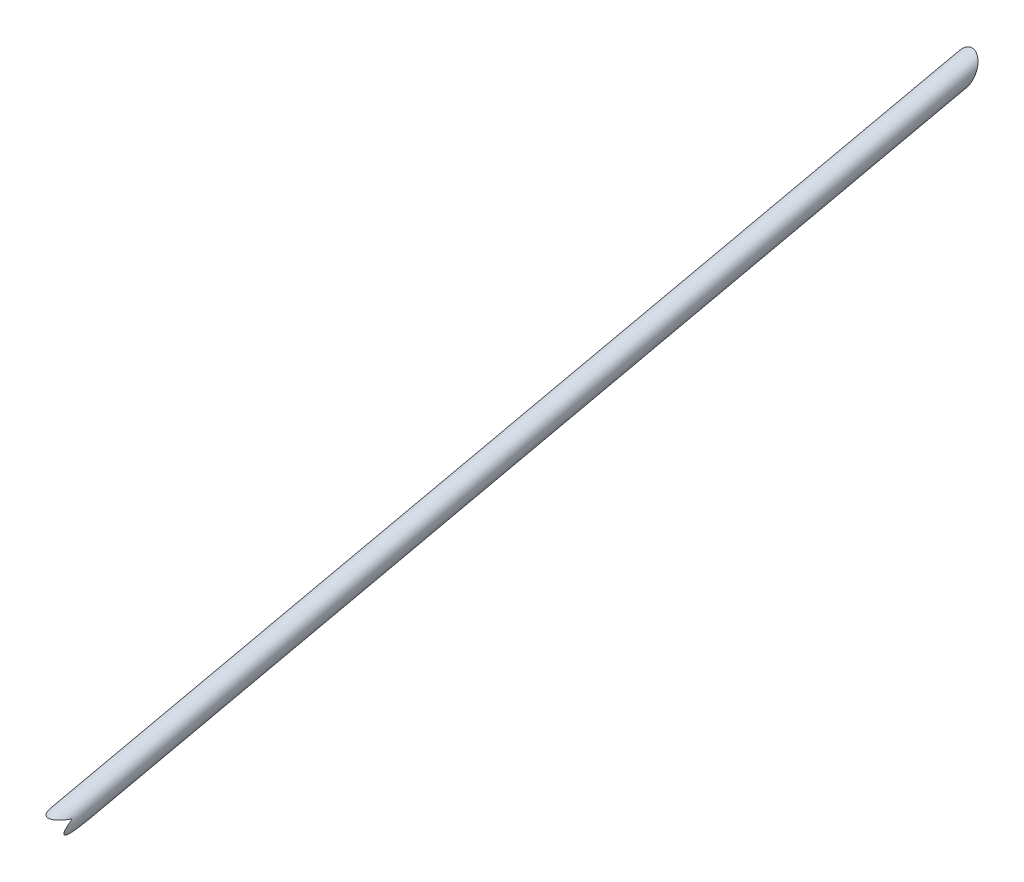
ISO-10303-21;
HEADER;
FILE_DESCRIPTION(('STEP AP214'),'2;1');
FILE_NAME('part.step','',(''),(''),'','','');
FILE_SCHEMA(('AUTOMOTIVE_DESIGN { 1 0 10303 214 1 1 1 1 }'));
ENDSEC;
DATA;
#1=APPLICATION_CONTEXT('core data for automotive mechanical design processes');
#2=APPLICATION_PROTOCOL_DEFINITION('international standard','automotive_design',2000,#1);
#3=PRODUCT_CONTEXT('',#1,'mechanical');
#4=PRODUCT('Part','Part','',(#3));
#5=PRODUCT_RELATED_PRODUCT_CATEGORY('part','',(#4));
#6=PRODUCT_DEFINITION_FORMATION('','',#4);
#7=PRODUCT_DEFINITION_CONTEXT('part definition',#1,'design');
#8=PRODUCT_DEFINITION('design','',#6,#7);
#9=PRODUCT_DEFINITION_SHAPE('','',#8);
#10=(LENGTH_UNIT() NAMED_UNIT(*) SI_UNIT(.MILLI.,.METRE.));
#11=(NAMED_UNIT(*) PLANE_ANGLE_UNIT() SI_UNIT($,.RADIAN.));
#12=(NAMED_UNIT(*) SI_UNIT($,.STERADIAN.) SOLID_ANGLE_UNIT());
#13=UNCERTAINTY_MEASURE_WITH_UNIT(LENGTH_MEASURE(1.E-05),#10,'distance_accuracy_value','');
#14=(GEOMETRIC_REPRESENTATION_CONTEXT(3) GLOBAL_UNCERTAINTY_ASSIGNED_CONTEXT((#13)) GLOBAL_UNIT_ASSIGNED_CONTEXT((#10,
#11,#12)) REPRESENTATION_CONTEXT('',''));
#15=CARTESIAN_POINT('',(0.,0.,0.));
#16=DIRECTION('',(0.,0.,1.));
#17=DIRECTION('',(1.,0.,0.));
#18=AXIS2_PLACEMENT_3D('',#15,#16,#17);
#19=CARTESIAN_POINT('',(-259.935326726564,10.,-1698.86453408839));
#20=DIRECTION('',(0.,-1.,0.));
#21=DIRECTION('',(0.,0.,-1.));
#22=AXIS2_PLACEMENT_3D('',#19,#20,#21);
#23=PLANE('',#22);
#24=CARTESIAN_POINT('',(174.290178571428,10.,-1013.28125));
#25=DIRECTION('',(0.,-1.,0.));
#26=DIRECTION('',(0.257001600590801,0.,-0.966410977428219));
#27=AXIS2_PLACEMENT_3D('',#24,#25,#26);
#28=ELLIPSE('',#27,20.327321302388,9.49999999999999);
#29=CARTESIAN_POINT('',(180.375016784295,10.,-1002.71182209354));
#30=VERTEX_POINT('',#29);
#31=CARTESIAN_POINT('',(183.391219448177,10.,-1029.10359540251));
#32=VERTEX_POINT('',#31);
#33=EDGE_CURVE('E11',#30,#32,#28,.T.);
#34=ORIENTED_EDGE('',*,*,#33,.T.);
#35=DIRECTION('',(-0.113546591160732,0.,0.993532672656404));
#36=VECTOR('',#35,1.);
#37=CARTESIAN_POINT('',(259.935326726564,10.,-1698.86453408839));
#38=LINE('',#37,#36);
#39=CARTESIAN_POINT('',(182.747352986209,10.,-1023.46976386029));
#40=VERTEX_POINT('',#39);
#41=EDGE_CURVE('E66',#32,#40,#38,.T.);
#42=ORIENTED_EDGE('',*,*,#41,.T.);
#43=CARTESIAN_POINT('',(174.290178571428,10.,-1013.28125));
#44=DIRECTION('',(0.,-1.,0.));
#45=DIRECTION('',(0.257001600590801,0.,-0.966410977428219));
#46=AXIS2_PLACEMENT_3D('',#43,#44,#45);
#47=ELLIPSE('',#46,16.9037724514595,7.90000000000002);
#48=CARTESIAN_POINT('',(181.018883246263,10.,-1008.34565363576));
#49=VERTEX_POINT('',#48);
#50=EDGE_CURVE('E81',#49,#40,#47,.T.);
#51=ORIENTED_EDGE('',*,*,#50,.F.);
#52=EDGE_CURVE('E68',#49,#30,#38,.T.);
#53=ORIENTED_EDGE('',*,*,#52,.T.);
#54=EDGE_LOOP('',(#34,#42,#51,#53));
#55=FACE_BOUND('',#54,.T.);
#56=ADVANCED_FACE('F41',(#55),#23,.T.);
#57=CARTESIAN_POINT('',(169.428571428571,1.66533453693773E-13,-994.999999999999));
#58=DIRECTION('',(0.227207840964846,0.4673512982197,-0.85437659205789));
#59=DIRECTION('',(0.,0.877321812102288,0.479902529696977));
#60=AXIS2_PLACEMENT_3D('',#57,#58,#59);
#61=CYLINDRICAL_SURFACE('',#60,9.49999999999999);
#62=ORIENTED_EDGE('',*,*,#33,.F.);
#63=CARTESIAN_POINT('',(187.078954115203,36.3056540110709,-1061.37127373899));
#64=DIRECTION('',(-0.993532672656404,0.,-0.113546591160732));
#65=DIRECTION('',(0.100146707762878,0.471272242379786,-0.876283692925177));
#66=AXIS2_PLACEMENT_3D('',#63,#64,#65);
#67=ELLIPSE('',#66,73.7996694176366,9.49999999999999);
#68=EDGE_CURVE('E73',#32,#30,#67,.T.);
#69=ORIENTED_EDGE('',*,*,#68,.F.);
#70=EDGE_LOOP('',(#62,#69));
#71=FACE_BOUND('',#70,.T.);
#72=CARTESIAN_POINT('',(325.,320.,-1580.));
#73=DIRECTION('',(0.0100583123703582,-0.349879267870479,-0.936740801004567));
#74=DIRECTION('',(0.287052887423583,0.898369431045867,-0.332465043552115));
#75=AXIS2_PLACEMENT_3D('',#72,#73,#74);
#76=ELLIPSE('',#75,14.8646950385778,9.49999999999999);
#77=CARTESIAN_POINT('',(329.266953631495,333.353987624478,-1584.94199148339));
#78=VERTEX_POINT('',#77);
#79=EDGE_CURVE('E50',#78,#78,#76,.T.);
#80=ORIENTED_EDGE('',*,*,#79,.F.);
#81=EDGE_LOOP('',(#80));
#82=FACE_BOUND('',#81,.T.);
#83=ADVANCED_FACE('F43',(#71,#82),#61,.T.);
#84=CARTESIAN_POINT('',(169.428571428571,1.66533453693773E-13,-994.999999999999));
#85=DIRECTION('',(0.227207840964846,0.4673512982197,-0.85437659205789));
#86=DIRECTION('',(0.,0.877321812102288,0.479902529696977));
#87=AXIS2_PLACEMENT_3D('',#84,#85,#86);
#88=CYLINDRICAL_SURFACE('',#87,7.90000000000002);
#89=CARTESIAN_POINT('',(187.078954115203,36.3056540110709,-1061.37127373899));
#90=DIRECTION('',(-0.993532672656404,0.,-0.113546591160732));
#91=DIRECTION('',(0.100146707762878,0.471272242379786,-0.876283692925177));
#92=AXIS2_PLACEMENT_3D('',#89,#90,#91);
#93=ELLIPSE('',#92,61.3702514104559,7.90000000000002);
#94=EDGE_CURVE('E57',#40,#49,#93,.T.);
#95=ORIENTED_EDGE('',*,*,#94,.T.);
#96=ORIENTED_EDGE('',*,*,#50,.T.);
#97=EDGE_LOOP('',(#95,#96));
#98=FACE_BOUND('',#97,.T.);
#99=CARTESIAN_POINT('',(325.,320.,-1580.));
#100=DIRECTION('',(0.0100583123703582,-0.349879267870479,-0.936740801004567));
#101=DIRECTION('',(0.287052887423583,0.898369431045867,-0.332465043552115));
#102=AXIS2_PLACEMENT_3D('',#99,#100,#101);
#103=ELLIPSE('',#102,12.3611674531331,7.90000000000002);
#104=CARTESIAN_POINT('',(328.548308809348,331.104894971934,-1584.10965607566));
#105=VERTEX_POINT('',#104);
#106=EDGE_CURVE('E74',#105,#105,#103,.T.);
#107=ORIENTED_EDGE('',*,*,#106,.T.);
#108=EDGE_LOOP('',(#107));
#109=FACE_BOUND('',#108,.T.);
#110=ADVANCED_FACE('F87',(#98,#109),#88,.F.);
#111=CARTESIAN_POINT('',(259.935326726564,10.,-1698.86453408839));
#112=DIRECTION('',(-0.993532672656404,0.,-0.113546591160732));
#113=DIRECTION('',(-0.113546591160732,0.,0.993532672656404));
#114=AXIS2_PLACEMENT_3D('',#111,#112,#113);
#115=PLANE('',#114);
#116=ORIENTED_EDGE('',*,*,#41,.F.);
#117=ORIENTED_EDGE('',*,*,#68,.T.);
#118=ORIENTED_EDGE('',*,*,#52,.F.);
#119=ORIENTED_EDGE('',*,*,#94,.F.);
#120=EDGE_LOOP('',(#116,#117,#118,#119));
#121=FACE_BOUND('',#120,.T.);
#122=ADVANCED_FACE('F72',(#121),#115,.T.);
#123=CARTESIAN_POINT('',(325.,320.,-1580.));
#124=DIRECTION('',(0.0100583123703582,-0.349879267870479,-0.936740801004567));
#125=DIRECTION('',(0.,0.936788189468734,-0.349896967794653));
#126=AXIS2_PLACEMENT_3D('',#123,#124,#125);
#127=PLANE('',#126);
#128=ORIENTED_EDGE('',*,*,#106,.F.);
#129=EDGE_LOOP('',(#128));
#130=FACE_BOUND('',#129,.T.);
#131=ORIENTED_EDGE('',*,*,#79,.T.);
#132=EDGE_LOOP('',(#131));
#133=FACE_BOUND('',#132,.T.);
#134=ADVANCED_FACE('F95',(#130,#133),#127,.T.);
#135=CLOSED_SHELL('',(#56,#83,#110,#122,#134));
#136=MANIFOLD_SOLID_BREP('B2',#135);
#137=ADVANCED_BREP_SHAPE_REPRESENTATION('',(#18,#136),#14);
#138=SHAPE_DEFINITION_REPRESENTATION(#9,#137);
ENDSEC;
END-ISO-10303-21;
